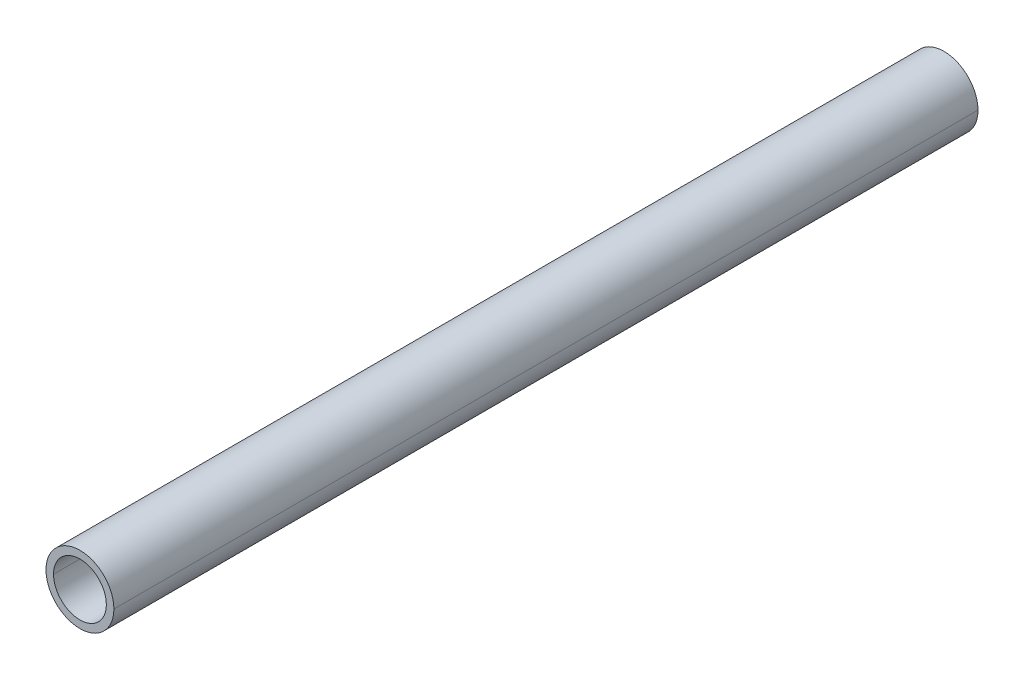
ISO-10303-21;
HEADER;
FILE_DESCRIPTION(('STEP AP214'),'2;1');
FILE_NAME('part.step','',(''),(''),'','','');
FILE_SCHEMA(('AUTOMOTIVE_DESIGN { 1 0 10303 214 1 1 1 1 }'));
ENDSEC;
DATA;
#1=APPLICATION_CONTEXT('core data for automotive mechanical design processes');
#2=APPLICATION_PROTOCOL_DEFINITION('international standard','automotive_design',2000,#1);
#3=PRODUCT_CONTEXT('',#1,'mechanical');
#4=PRODUCT('Part','Part','',(#3));
#5=PRODUCT_RELATED_PRODUCT_CATEGORY('part','',(#4));
#6=PRODUCT_DEFINITION_FORMATION('','',#4);
#7=PRODUCT_DEFINITION_CONTEXT('part definition',#1,'design');
#8=PRODUCT_DEFINITION('design','',#6,#7);
#9=PRODUCT_DEFINITION_SHAPE('','',#8);
#10=(LENGTH_UNIT() NAMED_UNIT(*) SI_UNIT(.MILLI.,.METRE.));
#11=(NAMED_UNIT(*) PLANE_ANGLE_UNIT() SI_UNIT($,.RADIAN.));
#12=(NAMED_UNIT(*) SI_UNIT($,.STERADIAN.) SOLID_ANGLE_UNIT());
#13=UNCERTAINTY_MEASURE_WITH_UNIT(LENGTH_MEASURE(1.E-05),#10,'distance_accuracy_value','');
#14=(GEOMETRIC_REPRESENTATION_CONTEXT(3) GLOBAL_UNCERTAINTY_ASSIGNED_CONTEXT((#13)) GLOBAL_UNIT_ASSIGNED_CONTEXT((#10,
#11,#12)) REPRESENTATION_CONTEXT('',''));
#15=CARTESIAN_POINT('',(0.,0.,0.));
#16=DIRECTION('',(0.,0.,1.));
#17=DIRECTION('',(1.,0.,0.));
#18=AXIS2_PLACEMENT_3D('',#15,#16,#17);
#19=CARTESIAN_POINT('',(0.,0.,229.14));
#20=DIRECTION('',(0.,0.,-1.));
#21=DIRECTION('',(-1.,0.,0.));
#22=AXIS2_PLACEMENT_3D('',#19,#20,#21);
#23=CYLINDRICAL_SURFACE('',#22,7.);
#24=DIRECTION('',(0.,0.,-1.));
#25=VECTOR('',#24,1.);
#26=CARTESIAN_POINT('',(7.,0.,229.14));
#27=LINE('',#26,#25);
#28=CARTESIAN_POINT('',(7.,0.,229.14));
#29=VERTEX_POINT('',#28);
#30=CARTESIAN_POINT('',(7.,0.,0.));
#31=VERTEX_POINT('',#30);
#32=EDGE_CURVE('E84',#29,#31,#27,.T.);
#33=ORIENTED_EDGE('',*,*,#32,.F.);
#34=CARTESIAN_POINT('',(0.,0.,229.14));
#35=DIRECTION('',(0.,0.,1.));
#36=DIRECTION('',(1.,0.,0.));
#37=AXIS2_PLACEMENT_3D('',#34,#35,#36);
#38=CIRCLE('',#37,7.);
#39=CARTESIAN_POINT('',(-7.,0.,229.14));
#40=VERTEX_POINT('',#39);
#41=EDGE_CURVE('E78',#29,#40,#38,.T.);
#42=ORIENTED_EDGE('',*,*,#41,.T.);
#43=DIRECTION('',(0.,0.,-1.));
#44=VECTOR('',#43,1.);
#45=CARTESIAN_POINT('',(-7.,0.,229.14));
#46=LINE('',#45,#44);
#47=CARTESIAN_POINT('',(-7.,0.,0.));
#48=VERTEX_POINT('',#47);
#49=EDGE_CURVE('E20',#40,#48,#46,.T.);
#50=ORIENTED_EDGE('',*,*,#49,.T.);
#51=CARTESIAN_POINT('',(0.,0.,0.));
#52=DIRECTION('',(0.,0.,1.));
#53=DIRECTION('',(1.,0.,0.));
#54=AXIS2_PLACEMENT_3D('',#51,#52,#53);
#55=CIRCLE('',#54,7.);
#56=EDGE_CURVE('E11',#31,#48,#55,.T.);
#57=ORIENTED_EDGE('',*,*,#56,.F.);
#58=EDGE_LOOP('',(#33,#42,#50,#57));
#59=FACE_BOUND('',#58,.T.);
#60=ADVANCED_FACE('F16',(#59),#23,.F.);
#61=CARTESIAN_POINT('',(0.,0.,229.14));
#62=DIRECTION('',(0.,0.,-1.));
#63=DIRECTION('',(-1.,0.,0.));
#64=AXIS2_PLACEMENT_3D('',#61,#62,#63);
#65=CYLINDRICAL_SURFACE('',#64,9.);
#66=DIRECTION('',(0.,0.,-1.));
#67=VECTOR('',#66,1.);
#68=CARTESIAN_POINT('',(9.,0.,229.14));
#69=LINE('',#68,#67);
#70=CARTESIAN_POINT('',(9.,0.,229.14));
#71=VERTEX_POINT('',#70);
#72=CARTESIAN_POINT('',(9.,0.,0.));
#73=VERTEX_POINT('',#72);
#74=EDGE_CURVE('E215',#71,#73,#69,.T.);
#75=ORIENTED_EDGE('',*,*,#74,.F.);
#76=CARTESIAN_POINT('',(0.,0.,229.14));
#77=DIRECTION('',(0.,0.,1.));
#78=DIRECTION('',(1.,0.,0.));
#79=AXIS2_PLACEMENT_3D('',#76,#77,#78);
#80=CIRCLE('',#79,9.);
#81=CARTESIAN_POINT('',(-9.,0.,229.14));
#82=VERTEX_POINT('',#81);
#83=EDGE_CURVE('E87',#82,#71,#80,.T.);
#84=ORIENTED_EDGE('',*,*,#83,.F.);
#85=DIRECTION('',(0.,0.,-1.));
#86=VECTOR('',#85,1.);
#87=CARTESIAN_POINT('',(-9.,0.,229.14));
#88=LINE('',#87,#86);
#89=CARTESIAN_POINT('',(-9.,0.,0.));
#90=VERTEX_POINT('',#89);
#91=EDGE_CURVE('E214',#82,#90,#88,.T.);
#92=ORIENTED_EDGE('',*,*,#91,.T.);
#93=CARTESIAN_POINT('',(0.,0.,0.));
#94=DIRECTION('',(0.,0.,1.));
#95=DIRECTION('',(1.,0.,0.));
#96=AXIS2_PLACEMENT_3D('',#93,#94,#95);
#97=CIRCLE('',#96,9.);
#98=EDGE_CURVE('E26',#90,#73,#97,.T.);
#99=ORIENTED_EDGE('',*,*,#98,.T.);
#100=EDGE_LOOP('',(#75,#84,#92,#99));
#101=FACE_BOUND('',#100,.T.);
#102=ADVANCED_FACE('F112',(#101),#65,.T.);
#103=CARTESIAN_POINT('',(0.,0.,0.));
#104=DIRECTION('',(0.,0.,1.));
#105=DIRECTION('',(1.,0.,0.));
#106=AXIS2_PLACEMENT_3D('',#103,#104,#105);
#107=PLANE('',#106);
#108=CARTESIAN_POINT('',(0.,0.,0.));
#109=DIRECTION('',(0.,0.,1.));
#110=DIRECTION('',(1.,0.,0.));
#111=AXIS2_PLACEMENT_3D('',#108,#109,#110);
#112=CIRCLE('',#111,7.);
#113=EDGE_CURVE('E91',#48,#31,#112,.T.);
#114=ORIENTED_EDGE('',*,*,#113,.T.);
#115=ORIENTED_EDGE('',*,*,#56,.T.);
#116=EDGE_LOOP('',(#114,#115));
#117=FACE_BOUND('',#116,.T.);
#118=ORIENTED_EDGE('',*,*,#98,.F.);
#119=CARTESIAN_POINT('',(0.,0.,0.));
#120=DIRECTION('',(0.,0.,1.));
#121=DIRECTION('',(1.,0.,0.));
#122=AXIS2_PLACEMENT_3D('',#119,#120,#121);
#123=CIRCLE('',#122,9.);
#124=EDGE_CURVE('E105',#73,#90,#123,.T.);
#125=ORIENTED_EDGE('',*,*,#124,.F.);
#126=EDGE_LOOP('',(#118,#125));
#127=FACE_BOUND('',#126,.T.);
#128=ADVANCED_FACE('F110',(#117,#127),#107,.F.);
#129=CARTESIAN_POINT('',(0.,0.,229.14));
#130=DIRECTION('',(0.,0.,1.));
#131=DIRECTION('',(1.,0.,0.));
#132=AXIS2_PLACEMENT_3D('',#129,#130,#131);
#133=PLANE('',#132);
#134=CARTESIAN_POINT('',(0.,0.,229.14));
#135=DIRECTION('',(0.,0.,1.));
#136=DIRECTION('',(1.,0.,0.));
#137=AXIS2_PLACEMENT_3D('',#134,#135,#136);
#138=CIRCLE('',#137,7.);
#139=EDGE_CURVE('E90',#40,#29,#138,.T.);
#140=ORIENTED_EDGE('',*,*,#139,.F.);
#141=ORIENTED_EDGE('',*,*,#41,.F.);
#142=EDGE_LOOP('',(#140,#141));
#143=FACE_BOUND('',#142,.T.);
#144=ORIENTED_EDGE('',*,*,#83,.T.);
#145=CARTESIAN_POINT('',(0.,0.,229.14));
#146=DIRECTION('',(0.,0.,1.));
#147=DIRECTION('',(1.,0.,0.));
#148=AXIS2_PLACEMENT_3D('',#145,#146,#147);
#149=CIRCLE('',#148,9.);
#150=EDGE_CURVE('E93',#71,#82,#149,.T.);
#151=ORIENTED_EDGE('',*,*,#150,.T.);
#152=EDGE_LOOP('',(#144,#151));
#153=FACE_BOUND('',#152,.T.);
#154=ADVANCED_FACE('F94',(#143,#153),#133,.T.);
#155=CARTESIAN_POINT('',(0.,0.,229.14));
#156=DIRECTION('',(0.,0.,-1.));
#157=DIRECTION('',(-1.,0.,0.));
#158=AXIS2_PLACEMENT_3D('',#155,#156,#157);
#159=CYLINDRICAL_SURFACE('',#158,9.);
#160=ORIENTED_EDGE('',*,*,#150,.F.);
#161=ORIENTED_EDGE('',*,*,#74,.T.);
#162=ORIENTED_EDGE('',*,*,#124,.T.);
#163=ORIENTED_EDGE('',*,*,#91,.F.);
#164=EDGE_LOOP('',(#160,#161,#162,#163));
#165=FACE_BOUND('',#164,.T.);
#166=ADVANCED_FACE('F119',(#165),#159,.T.);
#167=CARTESIAN_POINT('',(0.,0.,229.14));
#168=DIRECTION('',(0.,0.,-1.));
#169=DIRECTION('',(-1.,0.,0.));
#170=AXIS2_PLACEMENT_3D('',#167,#168,#169);
#171=CYLINDRICAL_SURFACE('',#170,7.);
#172=ORIENTED_EDGE('',*,*,#139,.T.);
#173=ORIENTED_EDGE('',*,*,#32,.T.);
#174=ORIENTED_EDGE('',*,*,#113,.F.);
#175=ORIENTED_EDGE('',*,*,#49,.F.);
#176=EDGE_LOOP('',(#172,#173,#174,#175));
#177=FACE_BOUND('',#176,.T.);
#178=ADVANCED_FACE('F18',(#177),#171,.F.);
#179=CLOSED_SHELL('',(#60,#102,#128,#154,#166,#178));
#180=MANIFOLD_SOLID_BREP('B1',#179);
#181=ADVANCED_BREP_SHAPE_REPRESENTATION('',(#18,#180),#14);
#182=SHAPE_DEFINITION_REPRESENTATION(#9,#181);
ENDSEC;
END-ISO-10303-21;
